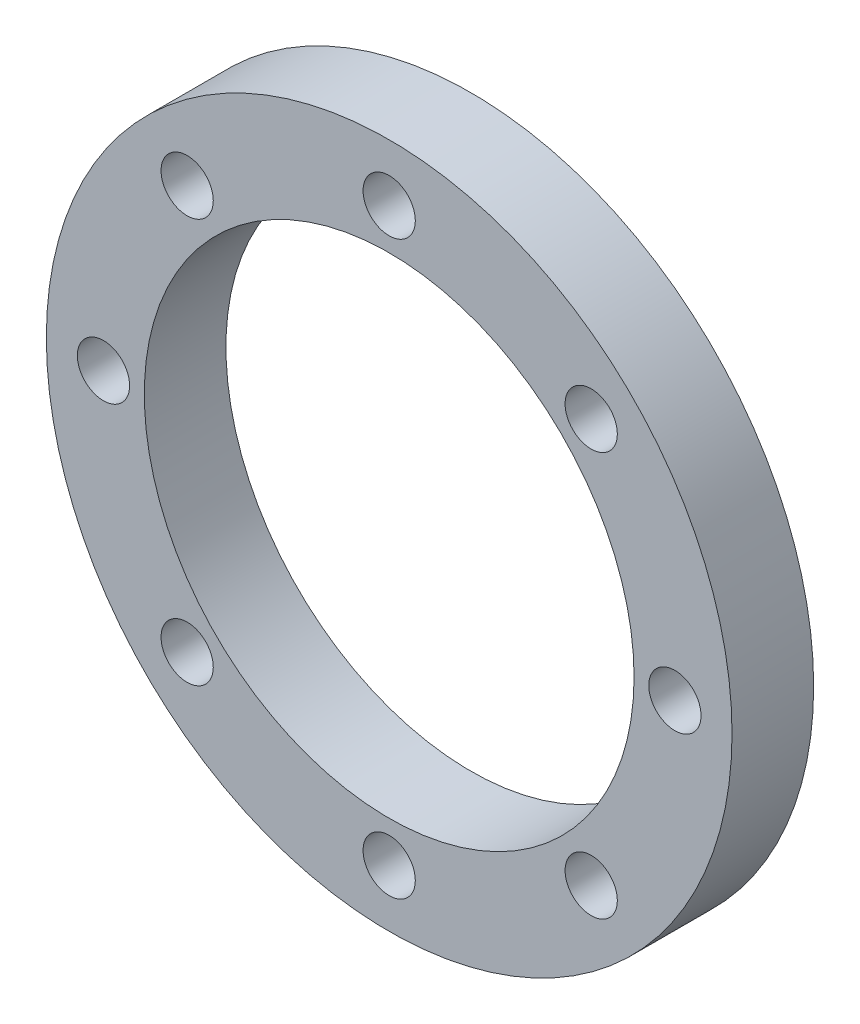
ISO-10303-21;
HEADER;
FILE_DESCRIPTION(('STEP AP214'),'2;1');
FILE_NAME('part.step','',(''),(''),'','','');
FILE_SCHEMA(('AUTOMOTIVE_DESIGN { 1 0 10303 214 1 1 1 1 }'));
ENDSEC;
DATA;
#1=APPLICATION_CONTEXT('core data for automotive mechanical design processes');
#2=APPLICATION_PROTOCOL_DEFINITION('international standard','automotive_design',2000,#1);
#3=PRODUCT_CONTEXT('',#1,'mechanical');
#4=PRODUCT('Part','Part','',(#3));
#5=PRODUCT_RELATED_PRODUCT_CATEGORY('part','',(#4));
#6=PRODUCT_DEFINITION_FORMATION('','',#4);
#7=PRODUCT_DEFINITION_CONTEXT('part definition',#1,'design');
#8=PRODUCT_DEFINITION('design','',#6,#7);
#9=PRODUCT_DEFINITION_SHAPE('','',#8);
#10=(LENGTH_UNIT() NAMED_UNIT(*) SI_UNIT(.MILLI.,.METRE.));
#11=(NAMED_UNIT(*) PLANE_ANGLE_UNIT() SI_UNIT($,.RADIAN.));
#12=(NAMED_UNIT(*) SI_UNIT($,.STERADIAN.) SOLID_ANGLE_UNIT());
#13=UNCERTAINTY_MEASURE_WITH_UNIT(LENGTH_MEASURE(1.E-05),#10,'distance_accuracy_value','');
#14=(GEOMETRIC_REPRESENTATION_CONTEXT(3) GLOBAL_UNCERTAINTY_ASSIGNED_CONTEXT((#13)) GLOBAL_UNIT_ASSIGNED_CONTEXT((#10,
#11,#12)) REPRESENTATION_CONTEXT('',''));
#15=CARTESIAN_POINT('',(0.,0.,0.));
#16=DIRECTION('',(0.,0.,1.));
#17=DIRECTION('',(1.,0.,0.));
#18=AXIS2_PLACEMENT_3D('',#15,#16,#17);
#19=CARTESIAN_POINT('',(0.,0.,5.));
#20=DIRECTION('',(0.,0.,1.));
#21=DIRECTION('',(1.,0.,0.));
#22=AXIS2_PLACEMENT_3D('',#19,#20,#21);
#23=PLANE('',#22);
#24=CARTESIAN_POINT('',(-17.5,0.,5.));
#25=DIRECTION('',(0.,0.,1.));
#26=DIRECTION('',(1.,0.,0.));
#27=AXIS2_PLACEMENT_3D('',#24,#25,#26);
#28=CIRCLE('',#27,1.6);
#29=CARTESIAN_POINT('',(-15.9,0.,5.));
#30=VERTEX_POINT('',#29);
#31=EDGE_CURVE('E10',#30,#30,#28,.T.);
#32=ORIENTED_EDGE('',*,*,#31,.F.);
#33=EDGE_LOOP('',(#32));
#34=FACE_BOUND('',#33,.T.);
#35=CARTESIAN_POINT('',(0.,-17.5,5.));
#36=DIRECTION('',(0.,0.,1.));
#37=DIRECTION('',(1.,0.,0.));
#38=AXIS2_PLACEMENT_3D('',#35,#36,#37);
#39=CIRCLE('',#38,1.6);
#40=CARTESIAN_POINT('',(1.6,-17.5,5.));
#41=VERTEX_POINT('',#40);
#42=EDGE_CURVE('E21',#41,#41,#39,.T.);
#43=ORIENTED_EDGE('',*,*,#42,.F.);
#44=EDGE_LOOP('',(#43));
#45=FACE_BOUND('',#44,.T.);
#46=CARTESIAN_POINT('',(17.5,0.,5.));
#47=DIRECTION('',(0.,0.,1.));
#48=DIRECTION('',(1.,0.,0.));
#49=AXIS2_PLACEMENT_3D('',#46,#47,#48);
#50=CIRCLE('',#49,1.60000000000001);
#51=CARTESIAN_POINT('',(19.1,0.,5.));
#52=VERTEX_POINT('',#51);
#53=EDGE_CURVE('E25',#52,#52,#50,.T.);
#54=ORIENTED_EDGE('',*,*,#53,.F.);
#55=EDGE_LOOP('',(#54));
#56=FACE_BOUND('',#55,.T.);
#57=CARTESIAN_POINT('',(0.,17.5,5.));
#58=DIRECTION('',(0.,0.,1.));
#59=DIRECTION('',(1.,0.,0.));
#60=AXIS2_PLACEMENT_3D('',#57,#58,#59);
#61=CIRCLE('',#60,1.6);
#62=CARTESIAN_POINT('',(1.6,17.5,5.));
#63=VERTEX_POINT('',#62);
#64=EDGE_CURVE('E29',#63,#63,#61,.T.);
#65=ORIENTED_EDGE('',*,*,#64,.F.);
#66=EDGE_LOOP('',(#65));
#67=FACE_BOUND('',#66,.T.);
#68=CARTESIAN_POINT('',(0.,0.,5.));
#69=DIRECTION('',(0.,0.,1.));
#70=DIRECTION('',(1.,0.,0.));
#71=AXIS2_PLACEMENT_3D('',#68,#69,#70);
#72=CIRCLE('',#71,21.);
#73=CARTESIAN_POINT('',(21.,0.,5.));
#74=VERTEX_POINT('',#73);
#75=EDGE_CURVE('E34',#74,#74,#72,.T.);
#76=ORIENTED_EDGE('',*,*,#75,.T.);
#77=EDGE_LOOP('',(#76));
#78=FACE_BOUND('',#77,.T.);
#79=CARTESIAN_POINT('',(0.,0.,5.));
#80=DIRECTION('',(0.,0.,1.));
#81=DIRECTION('',(1.,0.,0.));
#82=AXIS2_PLACEMENT_3D('',#79,#80,#81);
#83=CIRCLE('',#82,15.);
#84=CARTESIAN_POINT('',(15.,0.,5.));
#85=VERTEX_POINT('',#84);
#86=EDGE_CURVE('E37',#85,#85,#83,.T.);
#87=ORIENTED_EDGE('',*,*,#86,.F.);
#88=EDGE_LOOP('',(#87));
#89=FACE_BOUND('',#88,.T.);
#90=CARTESIAN_POINT('',(12.3743686707646,12.3743686707646,5.));
#91=DIRECTION('',(0.,0.,1.));
#92=DIRECTION('',(1.,0.,0.));
#93=AXIS2_PLACEMENT_3D('',#90,#91,#92);
#94=CIRCLE('',#93,1.6);
#95=CARTESIAN_POINT('',(13.9743686707646,12.3743686707646,5.));
#96=VERTEX_POINT('',#95);
#97=EDGE_CURVE('E40',#96,#96,#94,.T.);
#98=ORIENTED_EDGE('',*,*,#97,.F.);
#99=EDGE_LOOP('',(#98));
#100=FACE_BOUND('',#99,.T.);
#101=CARTESIAN_POINT('',(12.3743686707646,-12.3743686707646,5.));
#102=DIRECTION('',(0.,0.,1.));
#103=DIRECTION('',(1.,0.,0.));
#104=AXIS2_PLACEMENT_3D('',#101,#102,#103);
#105=CIRCLE('',#104,1.6);
#106=CARTESIAN_POINT('',(13.9743686707646,-12.3743686707646,5.));
#107=VERTEX_POINT('',#106);
#108=EDGE_CURVE('E43',#107,#107,#105,.T.);
#109=ORIENTED_EDGE('',*,*,#108,.F.);
#110=EDGE_LOOP('',(#109));
#111=FACE_BOUND('',#110,.T.);
#112=CARTESIAN_POINT('',(-12.3743686707646,-12.3743686707646,5.));
#113=DIRECTION('',(0.,0.,1.));
#114=DIRECTION('',(1.,0.,0.));
#115=AXIS2_PLACEMENT_3D('',#112,#113,#114);
#116=CIRCLE('',#115,1.6);
#117=CARTESIAN_POINT('',(-10.7743686707646,-12.3743686707646,5.));
#118=VERTEX_POINT('',#117);
#119=EDGE_CURVE('E46',#118,#118,#116,.T.);
#120=ORIENTED_EDGE('',*,*,#119,.F.);
#121=EDGE_LOOP('',(#120));
#122=FACE_BOUND('',#121,.T.);
#123=CARTESIAN_POINT('',(-12.3743686707646,12.3743686707646,5.));
#124=DIRECTION('',(0.,0.,1.));
#125=DIRECTION('',(1.,0.,0.));
#126=AXIS2_PLACEMENT_3D('',#123,#124,#125);
#127=CIRCLE('',#126,1.6);
#128=CARTESIAN_POINT('',(-10.7743686707646,12.3743686707646,5.));
#129=VERTEX_POINT('',#128);
#130=EDGE_CURVE('E49',#129,#129,#127,.T.);
#131=ORIENTED_EDGE('',*,*,#130,.F.);
#132=EDGE_LOOP('',(#131));
#133=FACE_BOUND('',#132,.T.);
#134=ADVANCED_FACE('F15',(#34,#45,#56,#67,#78,#89,#100,#111,#122,#133),#23,.T.);
#135=CARTESIAN_POINT('',(0.,0.,0.));
#136=DIRECTION('',(0.,0.,1.));
#137=DIRECTION('',(1.,0.,0.));
#138=AXIS2_PLACEMENT_3D('',#135,#136,#137);
#139=PLANE('',#138);
#140=CARTESIAN_POINT('',(0.,0.,0.));
#141=DIRECTION('',(0.,0.,1.));
#142=DIRECTION('',(1.,0.,0.));
#143=AXIS2_PLACEMENT_3D('',#140,#141,#142);
#144=CIRCLE('',#143,21.);
#145=CARTESIAN_POINT('',(21.,0.,0.));
#146=VERTEX_POINT('',#145);
#147=EDGE_CURVE('E52',#146,#146,#144,.T.);
#148=ORIENTED_EDGE('',*,*,#147,.F.);
#149=EDGE_LOOP('',(#148));
#150=FACE_BOUND('',#149,.T.);
#151=CARTESIAN_POINT('',(0.,0.,0.));
#152=DIRECTION('',(0.,0.,1.));
#153=DIRECTION('',(1.,0.,0.));
#154=AXIS2_PLACEMENT_3D('',#151,#152,#153);
#155=CIRCLE('',#154,15.);
#156=CARTESIAN_POINT('',(15.,0.,0.));
#157=VERTEX_POINT('',#156);
#158=EDGE_CURVE('E55',#157,#157,#155,.T.);
#159=ORIENTED_EDGE('',*,*,#158,.T.);
#160=EDGE_LOOP('',(#159));
#161=FACE_BOUND('',#160,.T.);
#162=CARTESIAN_POINT('',(0.,17.5,0.));
#163=DIRECTION('',(0.,0.,1.));
#164=DIRECTION('',(1.,0.,0.));
#165=AXIS2_PLACEMENT_3D('',#162,#163,#164);
#166=CIRCLE('',#165,1.6);
#167=CARTESIAN_POINT('',(1.6,17.5,0.));
#168=VERTEX_POINT('',#167);
#169=EDGE_CURVE('E58',#168,#168,#166,.T.);
#170=ORIENTED_EDGE('',*,*,#169,.T.);
#171=EDGE_LOOP('',(#170));
#172=FACE_BOUND('',#171,.T.);
#173=CARTESIAN_POINT('',(12.3743686707646,12.3743686707646,0.));
#174=DIRECTION('',(0.,0.,1.));
#175=DIRECTION('',(1.,0.,0.));
#176=AXIS2_PLACEMENT_3D('',#173,#174,#175);
#177=CIRCLE('',#176,1.6);
#178=CARTESIAN_POINT('',(13.9743686707646,12.3743686707646,0.));
#179=VERTEX_POINT('',#178);
#180=EDGE_CURVE('E61',#179,#179,#177,.T.);
#181=ORIENTED_EDGE('',*,*,#180,.T.);
#182=EDGE_LOOP('',(#181));
#183=FACE_BOUND('',#182,.T.);
#184=CARTESIAN_POINT('',(17.5,0.,0.));
#185=DIRECTION('',(0.,0.,1.));
#186=DIRECTION('',(1.,0.,0.));
#187=AXIS2_PLACEMENT_3D('',#184,#185,#186);
#188=CIRCLE('',#187,1.60000000000001);
#189=CARTESIAN_POINT('',(19.1,0.,0.));
#190=VERTEX_POINT('',#189);
#191=EDGE_CURVE('E64',#190,#190,#188,.T.);
#192=ORIENTED_EDGE('',*,*,#191,.T.);
#193=EDGE_LOOP('',(#192));
#194=FACE_BOUND('',#193,.T.);
#195=CARTESIAN_POINT('',(12.3743686707646,-12.3743686707646,0.));
#196=DIRECTION('',(0.,0.,1.));
#197=DIRECTION('',(1.,0.,0.));
#198=AXIS2_PLACEMENT_3D('',#195,#196,#197);
#199=CIRCLE('',#198,1.6);
#200=CARTESIAN_POINT('',(13.9743686707646,-12.3743686707646,0.));
#201=VERTEX_POINT('',#200);
#202=EDGE_CURVE('E67',#201,#201,#199,.T.);
#203=ORIENTED_EDGE('',*,*,#202,.T.);
#204=EDGE_LOOP('',(#203));
#205=FACE_BOUND('',#204,.T.);
#206=CARTESIAN_POINT('',(0.,-17.5,0.));
#207=DIRECTION('',(0.,0.,1.));
#208=DIRECTION('',(1.,0.,0.));
#209=AXIS2_PLACEMENT_3D('',#206,#207,#208);
#210=CIRCLE('',#209,1.6);
#211=CARTESIAN_POINT('',(1.6,-17.5,0.));
#212=VERTEX_POINT('',#211);
#213=EDGE_CURVE('E70',#212,#212,#210,.T.);
#214=ORIENTED_EDGE('',*,*,#213,.T.);
#215=EDGE_LOOP('',(#214));
#216=FACE_BOUND('',#215,.T.);
#217=CARTESIAN_POINT('',(-12.3743686707646,-12.3743686707646,0.));
#218=DIRECTION('',(0.,0.,1.));
#219=DIRECTION('',(1.,0.,0.));
#220=AXIS2_PLACEMENT_3D('',#217,#218,#219);
#221=CIRCLE('',#220,1.6);
#222=CARTESIAN_POINT('',(-10.7743686707646,-12.3743686707646,0.));
#223=VERTEX_POINT('',#222);
#224=EDGE_CURVE('E73',#223,#223,#221,.T.);
#225=ORIENTED_EDGE('',*,*,#224,.T.);
#226=EDGE_LOOP('',(#225));
#227=FACE_BOUND('',#226,.T.);
#228=CARTESIAN_POINT('',(-17.5,0.,0.));
#229=DIRECTION('',(0.,0.,1.));
#230=DIRECTION('',(1.,0.,0.));
#231=AXIS2_PLACEMENT_3D('',#228,#229,#230);
#232=CIRCLE('',#231,1.6);
#233=CARTESIAN_POINT('',(-15.9,0.,0.));
#234=VERTEX_POINT('',#233);
#235=EDGE_CURVE('E76',#234,#234,#232,.T.);
#236=ORIENTED_EDGE('',*,*,#235,.T.);
#237=EDGE_LOOP('',(#236));
#238=FACE_BOUND('',#237,.T.);
#239=CARTESIAN_POINT('',(-12.3743686707646,12.3743686707646,0.));
#240=DIRECTION('',(0.,0.,1.));
#241=DIRECTION('',(1.,0.,0.));
#242=AXIS2_PLACEMENT_3D('',#239,#240,#241);
#243=CIRCLE('',#242,1.6);
#244=CARTESIAN_POINT('',(-10.7743686707646,12.3743686707646,0.));
#245=VERTEX_POINT('',#244);
#246=EDGE_CURVE('E79',#245,#245,#243,.T.);
#247=ORIENTED_EDGE('',*,*,#246,.T.);
#248=EDGE_LOOP('',(#247));
#249=FACE_BOUND('',#248,.T.);
#250=ADVANCED_FACE('F83',(#150,#161,#172,#183,#194,#205,#216,#227,#238,#249),#139,.F.);
#251=CARTESIAN_POINT('',(0.,0.,5.));
#252=DIRECTION('',(0.,0.,-1.));
#253=DIRECTION('',(-1.,0.,0.));
#254=AXIS2_PLACEMENT_3D('',#251,#252,#253);
#255=CYLINDRICAL_SURFACE('',#254,21.);
#256=ORIENTED_EDGE('',*,*,#75,.F.);
#257=EDGE_LOOP('',(#256));
#258=FACE_BOUND('',#257,.T.);
#259=ORIENTED_EDGE('',*,*,#147,.T.);
#260=EDGE_LOOP('',(#259));
#261=FACE_BOUND('',#260,.T.);
#262=ADVANCED_FACE('F101',(#258,#261),#255,.T.);
#263=CARTESIAN_POINT('',(0.,0.,5.));
#264=DIRECTION('',(0.,0.,-1.));
#265=DIRECTION('',(-1.,0.,0.));
#266=AXIS2_PLACEMENT_3D('',#263,#264,#265);
#267=CYLINDRICAL_SURFACE('',#266,15.);
#268=ORIENTED_EDGE('',*,*,#86,.T.);
#269=EDGE_LOOP('',(#268));
#270=FACE_BOUND('',#269,.T.);
#271=ORIENTED_EDGE('',*,*,#158,.F.);
#272=EDGE_LOOP('',(#271));
#273=FACE_BOUND('',#272,.T.);
#274=ADVANCED_FACE('F150',(#270,#273),#267,.F.);
#275=CARTESIAN_POINT('',(0.,17.5,5.));
#276=DIRECTION('',(0.,0.,-1.));
#277=DIRECTION('',(-1.,0.,0.));
#278=AXIS2_PLACEMENT_3D('',#275,#276,#277);
#279=CYLINDRICAL_SURFACE('',#278,1.6);
#280=ORIENTED_EDGE('',*,*,#64,.T.);
#281=EDGE_LOOP('',(#280));
#282=FACE_BOUND('',#281,.T.);
#283=ORIENTED_EDGE('',*,*,#169,.F.);
#284=EDGE_LOOP('',(#283));
#285=FACE_BOUND('',#284,.T.);
#286=ADVANCED_FACE('F146',(#282,#285),#279,.F.);
#287=CARTESIAN_POINT('',(12.3743686707646,12.3743686707646,5.));
#288=DIRECTION('',(0.,0.,-1.));
#289=DIRECTION('',(-1.,0.,0.));
#290=AXIS2_PLACEMENT_3D('',#287,#288,#289);
#291=CYLINDRICAL_SURFACE('',#290,1.6);
#292=ORIENTED_EDGE('',*,*,#97,.T.);
#293=EDGE_LOOP('',(#292));
#294=FACE_BOUND('',#293,.T.);
#295=ORIENTED_EDGE('',*,*,#180,.F.);
#296=EDGE_LOOP('',(#295));
#297=FACE_BOUND('',#296,.T.);
#298=ADVANCED_FACE('F142',(#294,#297),#291,.F.);
#299=CARTESIAN_POINT('',(17.5,0.,5.));
#300=DIRECTION('',(0.,0.,-1.));
#301=DIRECTION('',(-1.,0.,0.));
#302=AXIS2_PLACEMENT_3D('',#299,#300,#301);
#303=CYLINDRICAL_SURFACE('',#302,1.60000000000001);
#304=ORIENTED_EDGE('',*,*,#53,.T.);
#305=EDGE_LOOP('',(#304));
#306=FACE_BOUND('',#305,.T.);
#307=ORIENTED_EDGE('',*,*,#191,.F.);
#308=EDGE_LOOP('',(#307));
#309=FACE_BOUND('',#308,.T.);
#310=ADVANCED_FACE('F138',(#306,#309),#303,.F.);
#311=CARTESIAN_POINT('',(12.3743686707646,-12.3743686707646,5.));
#312=DIRECTION('',(0.,0.,-1.));
#313=DIRECTION('',(-1.,0.,0.));
#314=AXIS2_PLACEMENT_3D('',#311,#312,#313);
#315=CYLINDRICAL_SURFACE('',#314,1.6);
#316=ORIENTED_EDGE('',*,*,#108,.T.);
#317=EDGE_LOOP('',(#316));
#318=FACE_BOUND('',#317,.T.);
#319=ORIENTED_EDGE('',*,*,#202,.F.);
#320=EDGE_LOOP('',(#319));
#321=FACE_BOUND('',#320,.T.);
#322=ADVANCED_FACE('F133',(#318,#321),#315,.F.);
#323=CARTESIAN_POINT('',(0.,-17.5,5.));
#324=DIRECTION('',(0.,0.,-1.));
#325=DIRECTION('',(-1.,0.,0.));
#326=AXIS2_PLACEMENT_3D('',#323,#324,#325);
#327=CYLINDRICAL_SURFACE('',#326,1.6);
#328=ORIENTED_EDGE('',*,*,#42,.T.);
#329=EDGE_LOOP('',(#328));
#330=FACE_BOUND('',#329,.T.);
#331=ORIENTED_EDGE('',*,*,#213,.F.);
#332=EDGE_LOOP('',(#331));
#333=FACE_BOUND('',#332,.T.);
#334=ADVANCED_FACE('F123',(#330,#333),#327,.F.);
#335=CARTESIAN_POINT('',(-12.3743686707646,-12.3743686707646,5.));
#336=DIRECTION('',(0.,0.,-1.));
#337=DIRECTION('',(-1.,0.,0.));
#338=AXIS2_PLACEMENT_3D('',#335,#336,#337);
#339=CYLINDRICAL_SURFACE('',#338,1.6);
#340=ORIENTED_EDGE('',*,*,#119,.T.);
#341=EDGE_LOOP('',(#340));
#342=FACE_BOUND('',#341,.T.);
#343=ORIENTED_EDGE('',*,*,#224,.F.);
#344=EDGE_LOOP('',(#343));
#345=FACE_BOUND('',#344,.T.);
#346=ADVANCED_FACE('F94',(#342,#345),#339,.F.);
#347=CARTESIAN_POINT('',(-17.5,0.,5.));
#348=DIRECTION('',(0.,0.,-1.));
#349=DIRECTION('',(-1.,0.,0.));
#350=AXIS2_PLACEMENT_3D('',#347,#348,#349);
#351=CYLINDRICAL_SURFACE('',#350,1.6);
#352=ORIENTED_EDGE('',*,*,#31,.T.);
#353=EDGE_LOOP('',(#352));
#354=FACE_BOUND('',#353,.T.);
#355=ORIENTED_EDGE('',*,*,#235,.F.);
#356=EDGE_LOOP('',(#355));
#357=FACE_BOUND('',#356,.T.);
#358=ADVANCED_FACE('F87',(#354,#357),#351,.F.);
#359=CARTESIAN_POINT('',(-12.3743686707646,12.3743686707646,5.));
#360=DIRECTION('',(0.,0.,-1.));
#361=DIRECTION('',(-1.,0.,0.));
#362=AXIS2_PLACEMENT_3D('',#359,#360,#361);
#363=CYLINDRICAL_SURFACE('',#362,1.6);
#364=ORIENTED_EDGE('',*,*,#130,.T.);
#365=EDGE_LOOP('',(#364));
#366=FACE_BOUND('',#365,.T.);
#367=ORIENTED_EDGE('',*,*,#246,.F.);
#368=EDGE_LOOP('',(#367));
#369=FACE_BOUND('',#368,.T.);
#370=ADVANCED_FACE('F85',(#366,#369),#363,.F.);
#371=CLOSED_SHELL('',(#134,#250,#262,#274,#286,#298,#310,#322,#334,#346,#358,#370));
#372=MANIFOLD_SOLID_BREP('B1',#371);
#373=ADVANCED_BREP_SHAPE_REPRESENTATION('',(#18,#372),#14);
#374=SHAPE_DEFINITION_REPRESENTATION(#9,#373);
ENDSEC;
END-ISO-10303-21;
